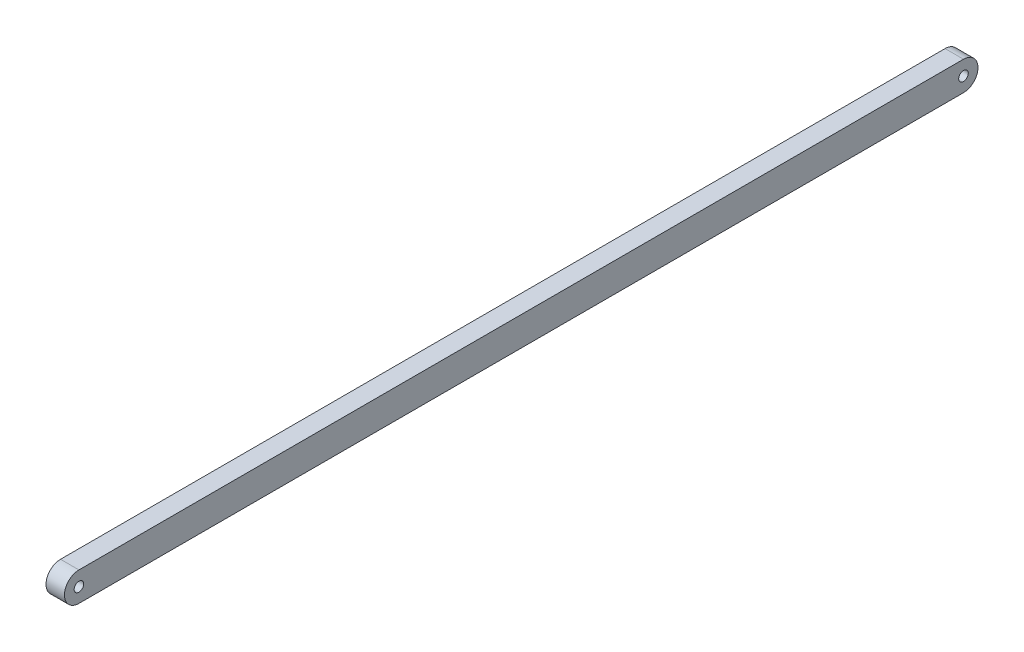
ISO-10303-21;
HEADER;
FILE_DESCRIPTION(('STEP AP214'),'2;1');
FILE_NAME('part.step','',(''),(''),'','','');
FILE_SCHEMA(('AUTOMOTIVE_DESIGN { 1 0 10303 214 1 1 1 1 }'));
ENDSEC;
DATA;
#1=APPLICATION_CONTEXT('core data for automotive mechanical design processes');
#2=APPLICATION_PROTOCOL_DEFINITION('international standard','automotive_design',2000,#1);
#3=PRODUCT_CONTEXT('',#1,'mechanical');
#4=PRODUCT('Part','Part','',(#3));
#5=PRODUCT_RELATED_PRODUCT_CATEGORY('part','',(#4));
#6=PRODUCT_DEFINITION_FORMATION('','',#4);
#7=PRODUCT_DEFINITION_CONTEXT('part definition',#1,'design');
#8=PRODUCT_DEFINITION('design','',#6,#7);
#9=PRODUCT_DEFINITION_SHAPE('','',#8);
#10=(LENGTH_UNIT() NAMED_UNIT(*) SI_UNIT(.MILLI.,.METRE.));
#11=(NAMED_UNIT(*) PLANE_ANGLE_UNIT() SI_UNIT($,.RADIAN.));
#12=(NAMED_UNIT(*) SI_UNIT($,.STERADIAN.) SOLID_ANGLE_UNIT());
#13=UNCERTAINTY_MEASURE_WITH_UNIT(LENGTH_MEASURE(1.E-05),#10,'distance_accuracy_value','');
#14=(GEOMETRIC_REPRESENTATION_CONTEXT(3) GLOBAL_UNCERTAINTY_ASSIGNED_CONTEXT((#13)) GLOBAL_UNIT_ASSIGNED_CONTEXT((#10,
#11,#12)) REPRESENTATION_CONTEXT('',''));
#15=CARTESIAN_POINT('',(0.,0.,0.));
#16=DIRECTION('',(0.,0.,1.));
#17=DIRECTION('',(1.,0.,0.));
#18=AXIS2_PLACEMENT_3D('',#15,#16,#17);
#19=CARTESIAN_POINT('',(6.35,0.,152.4));
#20=DIRECTION('',(1.,0.,0.));
#21=DIRECTION('',(0.,0.,-1.));
#22=AXIS2_PLACEMENT_3D('',#19,#20,#21);
#23=PLANE('',#22);
#24=CARTESIAN_POINT('',(6.35,0.,152.4));
#25=DIRECTION('',(1.,0.,0.));
#26=DIRECTION('',(0.,0.,-1.));
#27=AXIS2_PLACEMENT_3D('',#24,#25,#26);
#28=CIRCLE('',#27,1.65000000000002);
#29=CARTESIAN_POINT('',(6.35,0.,150.75));
#30=VERTEX_POINT('',#29);
#31=EDGE_CURVE('E100',#30,#30,#28,.T.);
#32=ORIENTED_EDGE('',*,*,#31,.F.);
#33=EDGE_LOOP('',(#32));
#34=FACE_BOUND('',#33,.T.);
#35=CARTESIAN_POINT('',(6.35,0.,152.4));
#36=DIRECTION('',(1.,0.,0.));
#37=DIRECTION('',(0.,0.,-1.));
#38=AXIS2_PLACEMENT_3D('',#35,#36,#37);
#39=CIRCLE('',#38,5.);
#40=CARTESIAN_POINT('',(6.35,5.,152.4));
#41=VERTEX_POINT('',#40);
#42=CARTESIAN_POINT('',(6.35,-5.,152.4));
#43=VERTEX_POINT('',#42);
#44=EDGE_CURVE('E85',#41,#43,#39,.T.);
#45=ORIENTED_EDGE('',*,*,#44,.T.);
#46=DIRECTION('',(0.,0.,-1.));
#47=VECTOR('',#46,1.);
#48=CARTESIAN_POINT('',(6.35,-5.,152.4));
#49=LINE('',#48,#47);
#50=CARTESIAN_POINT('',(6.35,-5.00000000000004,-152.4));
#51=VERTEX_POINT('',#50);
#52=EDGE_CURVE('E80',#43,#51,#49,.T.);
#53=ORIENTED_EDGE('',*,*,#52,.T.);
#54=CARTESIAN_POINT('',(6.35,0.,-152.4));
#55=DIRECTION('',(1.,0.,0.));
#56=DIRECTION('',(0.,0.,1.));
#57=AXIS2_PLACEMENT_3D('',#54,#55,#56);
#58=CIRCLE('',#57,5.00000000000004);
#59=CARTESIAN_POINT('',(6.35,5.00000000000004,-152.4));
#60=VERTEX_POINT('',#59);
#61=EDGE_CURVE('E83',#51,#60,#58,.T.);
#62=ORIENTED_EDGE('',*,*,#61,.T.);
#63=DIRECTION('',(0.,0.,1.));
#64=VECTOR('',#63,1.);
#65=CARTESIAN_POINT('',(6.35,5.,152.4));
#66=LINE('',#65,#64);
#67=EDGE_CURVE('E50',#60,#41,#66,.T.);
#68=ORIENTED_EDGE('',*,*,#67,.T.);
#69=EDGE_LOOP('',(#45,#53,#62,#68));
#70=FACE_BOUND('',#69,.T.);
#71=CARTESIAN_POINT('',(6.35,0.,-152.4));
#72=DIRECTION('',(1.,0.,0.));
#73=DIRECTION('',(0.,0.,1.));
#74=AXIS2_PLACEMENT_3D('',#71,#72,#73);
#75=CIRCLE('',#74,1.65000000000002);
#76=CARTESIAN_POINT('',(6.35,0.,-150.75));
#77=VERTEX_POINT('',#76);
#78=EDGE_CURVE('E115',#77,#77,#75,.T.);
#79=ORIENTED_EDGE('',*,*,#78,.F.);
#80=EDGE_LOOP('',(#79));
#81=FACE_BOUND('',#80,.T.);
#82=ADVANCED_FACE('F33',(#34,#70,#81),#23,.T.);
#83=CARTESIAN_POINT('',(0.,0.,152.4));
#84=DIRECTION('',(1.,0.,0.));
#85=DIRECTION('',(0.,0.,-1.));
#86=AXIS2_PLACEMENT_3D('',#83,#84,#85);
#87=PLANE('',#86);
#88=CARTESIAN_POINT('',(0.,0.,152.4));
#89=DIRECTION('',(1.,0.,0.));
#90=DIRECTION('',(0.,0.,-1.));
#91=AXIS2_PLACEMENT_3D('',#88,#89,#90);
#92=CIRCLE('',#91,5.);
#93=CARTESIAN_POINT('',(0.,5.,152.4));
#94=VERTEX_POINT('',#93);
#95=CARTESIAN_POINT('',(0.,-5.,152.4));
#96=VERTEX_POINT('',#95);
#97=EDGE_CURVE('E97',#94,#96,#92,.T.);
#98=ORIENTED_EDGE('',*,*,#97,.F.);
#99=DIRECTION('',(0.,0.,1.));
#100=VECTOR('',#99,1.);
#101=CARTESIAN_POINT('',(0.,5.,152.4));
#102=LINE('',#101,#100);
#103=CARTESIAN_POINT('',(0.,5.00000000000004,-152.4));
#104=VERTEX_POINT('',#103);
#105=EDGE_CURVE('E73',#104,#94,#102,.T.);
#106=ORIENTED_EDGE('',*,*,#105,.F.);
#107=CARTESIAN_POINT('',(0.,0.,-152.4));
#108=DIRECTION('',(1.,0.,0.));
#109=DIRECTION('',(0.,0.,1.));
#110=AXIS2_PLACEMENT_3D('',#107,#108,#109);
#111=CIRCLE('',#110,5.00000000000004);
#112=CARTESIAN_POINT('',(0.,-5.00000000000004,-152.4));
#113=VERTEX_POINT('',#112);
#114=EDGE_CURVE('E67',#113,#104,#111,.T.);
#115=ORIENTED_EDGE('',*,*,#114,.F.);
#116=DIRECTION('',(0.,0.,-1.));
#117=VECTOR('',#116,1.);
#118=CARTESIAN_POINT('',(0.,-5.,152.4));
#119=LINE('',#118,#117);
#120=EDGE_CURVE('E89',#96,#113,#119,.T.);
#121=ORIENTED_EDGE('',*,*,#120,.F.);
#122=EDGE_LOOP('',(#98,#106,#115,#121));
#123=FACE_BOUND('',#122,.T.);
#124=CARTESIAN_POINT('',(0.,0.,152.4));
#125=DIRECTION('',(1.,0.,0.));
#126=DIRECTION('',(0.,0.,-1.));
#127=AXIS2_PLACEMENT_3D('',#124,#125,#126);
#128=CIRCLE('',#127,1.65000000000002);
#129=CARTESIAN_POINT('',(0.,0.,150.75));
#130=VERTEX_POINT('',#129);
#131=EDGE_CURVE('E112',#130,#130,#128,.T.);
#132=ORIENTED_EDGE('',*,*,#131,.T.);
#133=EDGE_LOOP('',(#132));
#134=FACE_BOUND('',#133,.T.);
#135=CARTESIAN_POINT('',(0.,0.,-152.4));
#136=DIRECTION('',(1.,0.,0.));
#137=DIRECTION('',(0.,0.,1.));
#138=AXIS2_PLACEMENT_3D('',#135,#136,#137);
#139=CIRCLE('',#138,1.65000000000002);
#140=CARTESIAN_POINT('',(0.,0.,-150.75));
#141=VERTEX_POINT('',#140);
#142=EDGE_CURVE('E118',#141,#141,#139,.T.);
#143=ORIENTED_EDGE('',*,*,#142,.T.);
#144=EDGE_LOOP('',(#143));
#145=FACE_BOUND('',#144,.T.);
#146=ADVANCED_FACE('F108',(#123,#134,#145),#87,.F.);
#147=CARTESIAN_POINT('',(6.35,0.,152.4));
#148=DIRECTION('',(-1.,0.,0.));
#149=DIRECTION('',(0.,0.,1.));
#150=AXIS2_PLACEMENT_3D('',#147,#148,#149);
#151=CYLINDRICAL_SURFACE('',#150,5.);
#152=ORIENTED_EDGE('',*,*,#97,.T.);
#153=DIRECTION('',(-1.,0.,0.));
#154=VECTOR('',#153,1.);
#155=CARTESIAN_POINT('',(6.35,-5.,152.4));
#156=LINE('',#155,#154);
#157=EDGE_CURVE('E11',#43,#96,#156,.T.);
#158=ORIENTED_EDGE('',*,*,#157,.F.);
#159=ORIENTED_EDGE('',*,*,#44,.F.);
#160=DIRECTION('',(-1.,0.,0.));
#161=VECTOR('',#160,1.);
#162=CARTESIAN_POINT('',(6.35,5.,152.4));
#163=LINE('',#162,#161);
#164=EDGE_CURVE('E93',#41,#94,#163,.T.);
#165=ORIENTED_EDGE('',*,*,#164,.T.);
#166=EDGE_LOOP('',(#152,#158,#159,#165));
#167=FACE_BOUND('',#166,.T.);
#168=ADVANCED_FACE('F35',(#167),#151,.T.);
#169=CARTESIAN_POINT('',(6.35,-5.,152.4));
#170=DIRECTION('',(0.,1.,0.));
#171=DIRECTION('',(0.,0.,1.));
#172=AXIS2_PLACEMENT_3D('',#169,#170,#171);
#173=PLANE('',#172);
#174=ORIENTED_EDGE('',*,*,#120,.T.);
#175=DIRECTION('',(-1.,0.,0.));
#176=VECTOR('',#175,1.);
#177=CARTESIAN_POINT('',(6.35,-5.00000000000004,-152.4));
#178=LINE('',#177,#176);
#179=EDGE_CURVE('E42',#51,#113,#178,.T.);
#180=ORIENTED_EDGE('',*,*,#179,.F.);
#181=ORIENTED_EDGE('',*,*,#52,.F.);
#182=ORIENTED_EDGE('',*,*,#157,.T.);
#183=EDGE_LOOP('',(#174,#180,#181,#182));
#184=FACE_BOUND('',#183,.T.);
#185=ADVANCED_FACE('F88',(#184),#173,.F.);
#186=CARTESIAN_POINT('',(6.35,0.,-152.4));
#187=DIRECTION('',(-1.,0.,0.));
#188=DIRECTION('',(0.,0.,1.));
#189=AXIS2_PLACEMENT_3D('',#186,#187,#188);
#190=CYLINDRICAL_SURFACE('',#189,5.00000000000004);
#191=ORIENTED_EDGE('',*,*,#114,.T.);
#192=DIRECTION('',(-1.,0.,0.));
#193=VECTOR('',#192,1.);
#194=CARTESIAN_POINT('',(6.35,5.00000000000004,-152.4));
#195=LINE('',#194,#193);
#196=EDGE_CURVE('E90',#60,#104,#195,.T.);
#197=ORIENTED_EDGE('',*,*,#196,.F.);
#198=ORIENTED_EDGE('',*,*,#61,.F.);
#199=ORIENTED_EDGE('',*,*,#179,.T.);
#200=EDGE_LOOP('',(#191,#197,#198,#199));
#201=FACE_BOUND('',#200,.T.);
#202=ADVANCED_FACE('F91',(#201),#190,.T.);
#203=CARTESIAN_POINT('',(6.35,5.,152.4));
#204=DIRECTION('',(0.,-1.,0.));
#205=DIRECTION('',(0.,0.,-1.));
#206=AXIS2_PLACEMENT_3D('',#203,#204,#205);
#207=PLANE('',#206);
#208=ORIENTED_EDGE('',*,*,#105,.T.);
#209=ORIENTED_EDGE('',*,*,#164,.F.);
#210=ORIENTED_EDGE('',*,*,#67,.F.);
#211=ORIENTED_EDGE('',*,*,#196,.T.);
#212=EDGE_LOOP('',(#208,#209,#210,#211));
#213=FACE_BOUND('',#212,.T.);
#214=ADVANCED_FACE('F105',(#213),#207,.F.);
#215=CARTESIAN_POINT('',(6.35,0.,152.4));
#216=DIRECTION('',(-1.,0.,0.));
#217=DIRECTION('',(0.,0.,1.));
#218=AXIS2_PLACEMENT_3D('',#215,#216,#217);
#219=CYLINDRICAL_SURFACE('',#218,1.65000000000002);
#220=ORIENTED_EDGE('',*,*,#31,.T.);
#221=EDGE_LOOP('',(#220));
#222=FACE_BOUND('',#221,.T.);
#223=ORIENTED_EDGE('',*,*,#131,.F.);
#224=EDGE_LOOP('',(#223));
#225=FACE_BOUND('',#224,.T.);
#226=ADVANCED_FACE('F135',(#222,#225),#219,.F.);
#227=CARTESIAN_POINT('',(6.35,0.,-152.4));
#228=DIRECTION('',(-1.,0.,0.));
#229=DIRECTION('',(0.,0.,1.));
#230=AXIS2_PLACEMENT_3D('',#227,#228,#229);
#231=CYLINDRICAL_SURFACE('',#230,1.65000000000002);
#232=ORIENTED_EDGE('',*,*,#78,.T.);
#233=EDGE_LOOP('',(#232));
#234=FACE_BOUND('',#233,.T.);
#235=ORIENTED_EDGE('',*,*,#142,.F.);
#236=EDGE_LOOP('',(#235));
#237=FACE_BOUND('',#236,.T.);
#238=ADVANCED_FACE('F124',(#234,#237),#231,.F.);
#239=CLOSED_SHELL('',(#82,#146,#168,#185,#202,#214,#226,#238));
#240=MANIFOLD_SOLID_BREP('B2',#239);
#241=ADVANCED_BREP_SHAPE_REPRESENTATION('',(#18,#240),#14);
#242=SHAPE_DEFINITION_REPRESENTATION(#9,#241);
ENDSEC;
END-ISO-10303-21;
